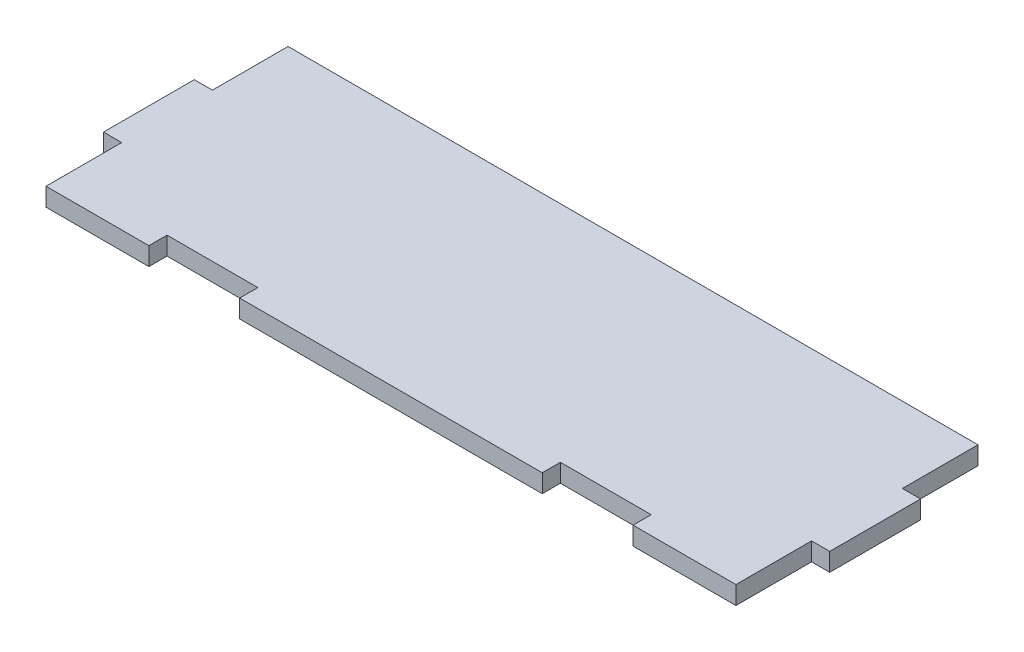
ISO-10303-21;
HEADER;
FILE_DESCRIPTION(('STEP AP214'),'2;1');
FILE_NAME('part.step','',(''),(''),'','','');
FILE_SCHEMA(('AUTOMOTIVE_DESIGN { 1 0 10303 214 1 1 1 1 }'));
ENDSEC;
DATA;
#1=APPLICATION_CONTEXT('core data for automotive mechanical design processes');
#2=APPLICATION_PROTOCOL_DEFINITION('international standard','automotive_design',2000,#1);
#3=PRODUCT_CONTEXT('',#1,'mechanical');
#4=PRODUCT('Part','Part','',(#3));
#5=PRODUCT_RELATED_PRODUCT_CATEGORY('part','',(#4));
#6=PRODUCT_DEFINITION_FORMATION('','',#4);
#7=PRODUCT_DEFINITION_CONTEXT('part definition',#1,'design');
#8=PRODUCT_DEFINITION('design','',#6,#7);
#9=PRODUCT_DEFINITION_SHAPE('','',#8);
#10=(LENGTH_UNIT() NAMED_UNIT(*) SI_UNIT(.MILLI.,.METRE.));
#11=(NAMED_UNIT(*) PLANE_ANGLE_UNIT() SI_UNIT($,.RADIAN.));
#12=(NAMED_UNIT(*) SI_UNIT($,.STERADIAN.) SOLID_ANGLE_UNIT());
#13=UNCERTAINTY_MEASURE_WITH_UNIT(LENGTH_MEASURE(1.E-05),#10,'distance_accuracy_value','');
#14=(GEOMETRIC_REPRESENTATION_CONTEXT(3) GLOBAL_UNCERTAINTY_ASSIGNED_CONTEXT((#13)) GLOBAL_UNIT_ASSIGNED_CONTEXT((#10,
#11,#12)) REPRESENTATION_CONTEXT('',''));
#15=CARTESIAN_POINT('',(0.,0.,0.));
#16=DIRECTION('',(0.,0.,1.));
#17=DIRECTION('',(1.,0.,0.));
#18=AXIS2_PLACEMENT_3D('',#15,#16,#17);
#19=CARTESIAN_POINT('',(-60.0000000000004,3.,20.0000000000001));
#20=DIRECTION('',(0.,0.,-1.00000000000001));
#21=DIRECTION('',(-1.00000000000001,0.,0.));
#22=AXIS2_PLACEMENT_3D('',#19,#20,#21);
#23=PLANE('',#22);
#24=DIRECTION('',(1.00000000000001,0.,0.));
#25=VECTOR('',#24,1.);
#26=CARTESIAN_POINT('',(-60.0000000000004,0.,20.0000000000001));
#27=LINE('',#26,#25);
#28=CARTESIAN_POINT('',(-25.,0.,20.));
#29=VERTEX_POINT('',#28);
#30=CARTESIAN_POINT('',(25.,0.,20.0000000000001));
#31=VERTEX_POINT('',#30);
#32=EDGE_CURVE('E186',#29,#31,#27,.T.);
#33=ORIENTED_EDGE('',*,*,#32,.T.);
#34=DIRECTION('',(0.,1.,0.));
#35=VECTOR('',#34,1.);
#36=CARTESIAN_POINT('',(25.,0.,20.0000000000001));
#37=LINE('',#36,#35);
#38=CARTESIAN_POINT('',(25.,3.,20.0000000000001));
#39=VERTEX_POINT('',#38);
#40=EDGE_CURVE('E170',#31,#39,#37,.T.);
#41=ORIENTED_EDGE('',*,*,#40,.T.);
#42=DIRECTION('',(1.00000000000001,0.,0.));
#43=VECTOR('',#42,1.);
#44=CARTESIAN_POINT('',(-60.0000000000004,3.,20.0000000000001));
#45=LINE('',#44,#43);
#46=CARTESIAN_POINT('',(-25.,3.,20.));
#47=VERTEX_POINT('',#46);
#48=EDGE_CURVE('E218',#47,#39,#45,.T.);
#49=ORIENTED_EDGE('',*,*,#48,.F.);
#50=DIRECTION('',(0.,1.,0.));
#51=VECTOR('',#50,1.);
#52=CARTESIAN_POINT('',(-25.,0.,20.));
#53=LINE('',#52,#51);
#54=EDGE_CURVE('E192',#29,#47,#53,.T.);
#55=ORIENTED_EDGE('',*,*,#54,.F.);
#56=EDGE_LOOP('',(#33,#41,#49,#55));
#57=FACE_BOUND('',#56,.T.);
#58=ADVANCED_FACE('F32',(#57),#23,.F.);
#59=CARTESIAN_POINT('',(-57.0000000000005,0.,20.));
#60=VERTEX_POINT('',#59);
#61=CARTESIAN_POINT('',(-40.,0.,20.));
#62=VERTEX_POINT('',#61);
#63=EDGE_CURVE('E193',#60,#62,#27,.T.);
#64=ORIENTED_EDGE('',*,*,#63,.T.);
#65=DIRECTION('',(0.,1.,0.));
#66=VECTOR('',#65,1.);
#67=CARTESIAN_POINT('',(-40.,0.,20.));
#68=LINE('',#67,#66);
#69=CARTESIAN_POINT('',(-40.,3.,20.));
#70=VERTEX_POINT('',#69);
#71=EDGE_CURVE('E308',#62,#70,#68,.T.);
#72=ORIENTED_EDGE('',*,*,#71,.T.);
#73=CARTESIAN_POINT('',(-57.0000000000005,3.,20.));
#74=VERTEX_POINT('',#73);
#75=EDGE_CURVE('E220',#74,#70,#45,.T.);
#76=ORIENTED_EDGE('',*,*,#75,.F.);
#77=DIRECTION('',(0.,1.,0.));
#78=VECTOR('',#77,1.);
#79=CARTESIAN_POINT('',(-57.0000000000005,0.,20.));
#80=LINE('',#79,#78);
#81=EDGE_CURVE('E263',#60,#74,#80,.T.);
#82=ORIENTED_EDGE('',*,*,#81,.F.);
#83=EDGE_LOOP('',(#64,#72,#76,#82));
#84=FACE_BOUND('',#83,.T.);
#85=ADVANCED_FACE('F306',(#84),#23,.F.);
#86=CARTESIAN_POINT('',(-60.0000000000005,3.,-20.));
#87=DIRECTION('',(1.00000000000001,0.,0.));
#88=DIRECTION('',(0.,0.,-1.00000000000001));
#89=AXIS2_PLACEMENT_3D('',#86,#87,#88);
#90=PLANE('',#89);
#91=DIRECTION('',(0.,0.,1.00000000000001));
#92=VECTOR('',#91,1.);
#93=CARTESIAN_POINT('',(-60.0000000000005,0.,-20.));
#94=LINE('',#93,#92);
#95=CARTESIAN_POINT('',(-60.0000000000003,0.,-7.50000000000006));
#96=VERTEX_POINT('',#95);
#97=CARTESIAN_POINT('',(-60.0000000000004,0.,7.50000000000012));
#98=VERTEX_POINT('',#97);
#99=EDGE_CURVE('E198',#96,#98,#94,.T.);
#100=ORIENTED_EDGE('',*,*,#99,.T.);
#101=DIRECTION('',(0.,1.,0.));
#102=VECTOR('',#101,1.);
#103=CARTESIAN_POINT('',(-60.0000000000004,0.,7.50000000000012));
#104=LINE('',#103,#102);
#105=CARTESIAN_POINT('',(-60.0000000000004,3.,7.50000000000012));
#106=VERTEX_POINT('',#105);
#107=EDGE_CURVE('E266',#98,#106,#104,.T.);
#108=ORIENTED_EDGE('',*,*,#107,.T.);
#109=DIRECTION('',(0.,0.,1.00000000000001));
#110=VECTOR('',#109,1.);
#111=CARTESIAN_POINT('',(-60.0000000000005,3.,-20.));
#112=LINE('',#111,#110);
#113=CARTESIAN_POINT('',(-60.0000000000003,3.,-7.50000000000006));
#114=VERTEX_POINT('',#113);
#115=EDGE_CURVE('E205',#114,#106,#112,.T.);
#116=ORIENTED_EDGE('',*,*,#115,.F.);
#117=DIRECTION('',(0.,1.,0.));
#118=VECTOR('',#117,1.);
#119=CARTESIAN_POINT('',(-60.0000000000003,0.,-7.50000000000006));
#120=LINE('',#119,#118);
#121=EDGE_CURVE('E222',#96,#114,#120,.T.);
#122=ORIENTED_EDGE('',*,*,#121,.F.);
#123=EDGE_LOOP('',(#100,#108,#116,#122));
#124=FACE_BOUND('',#123,.T.);
#125=ADVANCED_FACE('F34',(#124),#90,.F.);
#126=CARTESIAN_POINT('',(40.0000000000001,3.,20.0000000000007));
#127=VERTEX_POINT('',#126);
#128=CARTESIAN_POINT('',(57.0000000000003,3.,20.0000000000001));
#129=VERTEX_POINT('',#128);
#130=EDGE_CURVE('E212',#127,#129,#45,.T.);
#131=ORIENTED_EDGE('',*,*,#130,.F.);
#132=DIRECTION('',(0.,1.,0.));
#133=VECTOR('',#132,1.);
#134=CARTESIAN_POINT('',(40.0000000000001,0.,20.0000000000007));
#135=LINE('',#134,#133);
#136=CARTESIAN_POINT('',(40.0000000000001,0.,20.0000000000007));
#137=VERTEX_POINT('',#136);
#138=EDGE_CURVE('E180',#137,#127,#135,.T.);
#139=ORIENTED_EDGE('',*,*,#138,.F.);
#140=CARTESIAN_POINT('',(57.0000000000003,0.,20.0000000000001));
#141=VERTEX_POINT('',#140);
#142=EDGE_CURVE('E194',#137,#141,#27,.T.);
#143=ORIENTED_EDGE('',*,*,#142,.T.);
#144=DIRECTION('',(0.,1.,0.));
#145=VECTOR('',#144,1.);
#146=CARTESIAN_POINT('',(57.0000000000003,0.,20.0000000000001));
#147=LINE('',#146,#145);
#148=EDGE_CURVE('E345',#141,#129,#147,.T.);
#149=ORIENTED_EDGE('',*,*,#148,.T.);
#150=EDGE_LOOP('',(#131,#139,#143,#149));
#151=FACE_BOUND('',#150,.T.);
#152=ADVANCED_FACE('F367',(#151),#23,.F.);
#153=CARTESIAN_POINT('',(60.0000000000003,3.,-19.9999999999995));
#154=DIRECTION('',(-1.00000000000001,0.,0.));
#155=DIRECTION('',(0.,0.,1.00000000000001));
#156=AXIS2_PLACEMENT_3D('',#153,#154,#155);
#157=PLANE('',#156);
#158=DIRECTION('',(0.,0.,-1.00000000000001));
#159=VECTOR('',#158,1.);
#160=CARTESIAN_POINT('',(60.0000000000003,3.,-19.9999999999995));
#161=LINE('',#160,#159);
#162=CARTESIAN_POINT('',(60.0000000000003,3.,7.50000000000028));
#163=VERTEX_POINT('',#162);
#164=CARTESIAN_POINT('',(60.0000000000003,3.,-7.49999999999951));
#165=VERTEX_POINT('',#164);
#166=EDGE_CURVE('E41',#163,#165,#161,.T.);
#167=ORIENTED_EDGE('',*,*,#166,.F.);
#168=DIRECTION('',(0.,1.,0.));
#169=VECTOR('',#168,1.);
#170=CARTESIAN_POINT('',(60.0000000000003,0.,7.50000000000028));
#171=LINE('',#170,#169);
#172=CARTESIAN_POINT('',(60.0000000000003,0.,7.50000000000028));
#173=VERTEX_POINT('',#172);
#174=EDGE_CURVE('E341',#173,#163,#171,.T.);
#175=ORIENTED_EDGE('',*,*,#174,.F.);
#176=DIRECTION('',(0.,0.,-1.00000000000001));
#177=VECTOR('',#176,1.);
#178=CARTESIAN_POINT('',(60.0000000000003,0.,-19.9999999999995));
#179=LINE('',#178,#177);
#180=CARTESIAN_POINT('',(60.0000000000003,0.,-7.49999999999951));
#181=VERTEX_POINT('',#180);
#182=EDGE_CURVE('E197',#173,#181,#179,.T.);
#183=ORIENTED_EDGE('',*,*,#182,.T.);
#184=DIRECTION('',(0.,1.,0.));
#185=VECTOR('',#184,1.);
#186=CARTESIAN_POINT('',(60.0000000000003,0.,-7.49999999999951));
#187=LINE('',#186,#185);
#188=EDGE_CURVE('E238',#181,#165,#187,.T.);
#189=ORIENTED_EDGE('',*,*,#188,.T.);
#190=EDGE_LOOP('',(#167,#175,#183,#189));
#191=FACE_BOUND('',#190,.T.);
#192=ADVANCED_FACE('F246',(#191),#157,.F.);
#193=CARTESIAN_POINT('',(-60.0000000000005,3.,-20.));
#194=DIRECTION('',(0.,0.,1.00000000000001));
#195=DIRECTION('',(1.00000000000001,0.,0.));
#196=AXIS2_PLACEMENT_3D('',#193,#194,#195);
#197=PLANE('',#196);
#198=DIRECTION('',(-1.00000000000001,0.,0.));
#199=VECTOR('',#198,1.);
#200=CARTESIAN_POINT('',(-60.0000000000005,3.,-20.));
#201=LINE('',#200,#199);
#202=CARTESIAN_POINT('',(57.0000000000001,3.,-19.9999999999996));
#203=VERTEX_POINT('',#202);
#204=CARTESIAN_POINT('',(-57.0000000000006,3.,-19.9999999999999));
#205=VERTEX_POINT('',#204);
#206=EDGE_CURVE('E11',#203,#205,#201,.T.);
#207=ORIENTED_EDGE('',*,*,#206,.F.);
#208=DIRECTION('',(0.,1.,0.));
#209=VECTOR('',#208,1.);
#210=CARTESIAN_POINT('',(57.0000000000001,0.,-19.9999999999996));
#211=LINE('',#210,#209);
#212=CARTESIAN_POINT('',(57.0000000000001,0.,-19.9999999999996));
#213=VERTEX_POINT('',#212);
#214=EDGE_CURVE('E252',#213,#203,#211,.T.);
#215=ORIENTED_EDGE('',*,*,#214,.F.);
#216=DIRECTION('',(-1.00000000000001,0.,0.));
#217=VECTOR('',#216,1.);
#218=CARTESIAN_POINT('',(-60.0000000000005,0.,-20.));
#219=LINE('',#218,#217);
#220=CARTESIAN_POINT('',(-57.0000000000006,0.,-19.9999999999999));
#221=VERTEX_POINT('',#220);
#222=EDGE_CURVE('E36',#213,#221,#219,.T.);
#223=ORIENTED_EDGE('',*,*,#222,.T.);
#224=DIRECTION('',(0.,1.,0.));
#225=VECTOR('',#224,1.);
#226=CARTESIAN_POINT('',(-57.0000000000006,0.,-19.9999999999999));
#227=LINE('',#226,#225);
#228=EDGE_CURVE('E284',#221,#205,#227,.T.);
#229=ORIENTED_EDGE('',*,*,#228,.T.);
#230=EDGE_LOOP('',(#207,#215,#223,#229));
#231=FACE_BOUND('',#230,.T.);
#232=ADVANCED_FACE('F356',(#231),#197,.F.);
#233=CARTESIAN_POINT('',(0.,3.,0.));
#234=DIRECTION('',(0.,1.,0.));
#235=DIRECTION('',(0.,0.,1.00000000000001));
#236=AXIS2_PLACEMENT_3D('',#233,#234,#235);
#237=PLANE('',#236);
#238=DIRECTION('',(0.,0.,1.00000000000001));
#239=VECTOR('',#238,1.);
#240=CARTESIAN_POINT('',(25.,3.,20.0000000000001));
#241=LINE('',#240,#239);
#242=CARTESIAN_POINT('',(25.,3.,17.));
#243=VERTEX_POINT('',#242);
#244=EDGE_CURVE('E175',#243,#39,#241,.T.);
#245=ORIENTED_EDGE('',*,*,#244,.F.);
#246=DIRECTION('',(-1.00000000000001,0.,0.));
#247=VECTOR('',#246,1.);
#248=CARTESIAN_POINT('',(25.,3.,17.));
#249=LINE('',#248,#247);
#250=CARTESIAN_POINT('',(40.0000000000001,3.,17.0000000000006));
#251=VERTEX_POINT('',#250);
#252=EDGE_CURVE('E189',#251,#243,#249,.T.);
#253=ORIENTED_EDGE('',*,*,#252,.F.);
#254=DIRECTION('',(0.,0.,-1.00000000000001));
#255=VECTOR('',#254,1.);
#256=CARTESIAN_POINT('',(40.0000000000001,3.,20.0000000000007));
#257=LINE('',#256,#255);
#258=EDGE_CURVE('E374',#127,#251,#257,.T.);
#259=ORIENTED_EDGE('',*,*,#258,.F.);
#260=ORIENTED_EDGE('',*,*,#130,.T.);
#261=DIRECTION('',(0.,0.,1.00000000000001));
#262=VECTOR('',#261,1.);
#263=CARTESIAN_POINT('',(57.0000000000003,3.,20.0000000000001));
#264=LINE('',#263,#262);
#265=CARTESIAN_POINT('',(57.0000000000003,3.,7.50000000000012));
#266=VERTEX_POINT('',#265);
#267=EDGE_CURVE('E338',#266,#129,#264,.T.);
#268=ORIENTED_EDGE('',*,*,#267,.F.);
#269=DIRECTION('',(-1.00000000000001,0.,0.));
#270=VECTOR('',#269,1.);
#271=CARTESIAN_POINT('',(60.0000000000003,3.,7.50000000000028));
#272=LINE('',#271,#270);
#273=EDGE_CURVE('E235',#163,#266,#272,.T.);
#274=ORIENTED_EDGE('',*,*,#273,.F.);
#275=ORIENTED_EDGE('',*,*,#166,.T.);
#276=DIRECTION('',(1.00000000000001,0.,0.));
#277=VECTOR('',#276,1.);
#278=CARTESIAN_POINT('',(60.0000000000003,3.,-7.49999999999951));
#279=LINE('',#278,#277);
#280=CARTESIAN_POINT('',(57.0000000000003,3.,-7.49999999999962));
#281=VERTEX_POINT('',#280);
#282=EDGE_CURVE('E232',#281,#165,#279,.T.);
#283=ORIENTED_EDGE('',*,*,#282,.F.);
#284=DIRECTION('',(0.,0.,1.00000000000001));
#285=VECTOR('',#284,1.);
#286=CARTESIAN_POINT('',(57.0000000000001,3.,-19.9999999999996));
#287=LINE('',#286,#285);
#288=EDGE_CURVE('E244',#203,#281,#287,.T.);
#289=ORIENTED_EDGE('',*,*,#288,.F.);
#290=ORIENTED_EDGE('',*,*,#206,.T.);
#291=DIRECTION('',(0.,0.,-1.00000000000001));
#292=VECTOR('',#291,1.);
#293=CARTESIAN_POINT('',(-57.0000000000006,3.,-19.9999999999999));
#294=LINE('',#293,#292);
#295=CARTESIAN_POINT('',(-57.0000000000004,3.,-7.49999999999995));
#296=VERTEX_POINT('',#295);
#297=EDGE_CURVE('E277',#296,#205,#294,.T.);
#298=ORIENTED_EDGE('',*,*,#297,.F.);
#299=DIRECTION('',(1.00000000000001,0.,0.));
#300=VECTOR('',#299,1.);
#301=CARTESIAN_POINT('',(-60.0000000000003,3.,-7.50000000000006));
#302=LINE('',#301,#300);
#303=EDGE_CURVE('E269',#114,#296,#302,.T.);
#304=ORIENTED_EDGE('',*,*,#303,.F.);
#305=ORIENTED_EDGE('',*,*,#115,.T.);
#306=DIRECTION('',(-1.00000000000001,0.,0.));
#307=VECTOR('',#306,1.);
#308=CARTESIAN_POINT('',(-60.0000000000004,3.,7.50000000000012));
#309=LINE('',#308,#307);
#310=CARTESIAN_POINT('',(-57.0000000000005,3.,7.49999999999984));
#311=VERTEX_POINT('',#310);
#312=EDGE_CURVE('E250',#311,#106,#309,.T.);
#313=ORIENTED_EDGE('',*,*,#312,.F.);
#314=DIRECTION('',(0.,0.,-1.00000000000001));
#315=VECTOR('',#314,1.);
#316=CARTESIAN_POINT('',(-57.0000000000005,3.,20.));
#317=LINE('',#316,#315);
#318=EDGE_CURVE('E247',#74,#311,#317,.T.);
#319=ORIENTED_EDGE('',*,*,#318,.F.);
#320=ORIENTED_EDGE('',*,*,#75,.T.);
#321=DIRECTION('',(0.,0.,1.00000000000001));
#322=VECTOR('',#321,1.);
#323=CARTESIAN_POINT('',(-40.,3.,20.));
#324=LINE('',#323,#322);
#325=CARTESIAN_POINT('',(-40.0000000000001,3.,17.0000000000001));
#326=VERTEX_POINT('',#325);
#327=EDGE_CURVE('E311',#326,#70,#324,.T.);
#328=ORIENTED_EDGE('',*,*,#327,.F.);
#329=DIRECTION('',(-1.00000000000001,0.,0.));
#330=VECTOR('',#329,1.);
#331=CARTESIAN_POINT('',(-40.0000000000001,3.,17.0000000000001));
#332=LINE('',#331,#330);
#333=CARTESIAN_POINT('',(-25.,3.,17.0000000000001));
#334=VERTEX_POINT('',#333);
#335=EDGE_CURVE('E314',#334,#326,#332,.T.);
#336=ORIENTED_EDGE('',*,*,#335,.F.);
#337=DIRECTION('',(0.,0.,-1.00000000000001));
#338=VECTOR('',#337,1.);
#339=CARTESIAN_POINT('',(-25.,3.,20.));
#340=LINE('',#339,#338);
#341=EDGE_CURVE('E316',#47,#334,#340,.T.);
#342=ORIENTED_EDGE('',*,*,#341,.F.);
#343=ORIENTED_EDGE('',*,*,#48,.T.);
#344=EDGE_LOOP('',(#245,#253,#259,#260,#268,#274,#275,#283,#289,#290,#298,#304,#305,#313,#319,
#320,#328,#336,#342,#343));
#345=FACE_BOUND('',#344,.T.);
#346=ADVANCED_FACE('F230',(#345),#237,.T.);
#347=CARTESIAN_POINT('',(0.,0.,0.));
#348=DIRECTION('',(0.,1.,0.));
#349=DIRECTION('',(0.,0.,1.00000000000001));
#350=AXIS2_PLACEMENT_3D('',#347,#348,#349);
#351=PLANE('',#350);
#352=DIRECTION('',(-1.00000000000001,0.,0.));
#353=VECTOR('',#352,1.);
#354=CARTESIAN_POINT('',(25.,0.,17.));
#355=LINE('',#354,#353);
#356=CARTESIAN_POINT('',(40.0000000000001,0.,17.0000000000006));
#357=VERTEX_POINT('',#356);
#358=CARTESIAN_POINT('',(25.,0.,17.));
#359=VERTEX_POINT('',#358);
#360=EDGE_CURVE('E49',#357,#359,#355,.T.);
#361=ORIENTED_EDGE('',*,*,#360,.T.);
#362=DIRECTION('',(0.,0.,1.00000000000001));
#363=VECTOR('',#362,1.);
#364=CARTESIAN_POINT('',(25.,0.,20.0000000000001));
#365=LINE('',#364,#363);
#366=EDGE_CURVE('E173',#359,#31,#365,.T.);
#367=ORIENTED_EDGE('',*,*,#366,.T.);
#368=ORIENTED_EDGE('',*,*,#32,.F.);
#369=DIRECTION('',(0.,0.,-1.00000000000001));
#370=VECTOR('',#369,1.);
#371=CARTESIAN_POINT('',(-25.,0.,20.));
#372=LINE('',#371,#370);
#373=CARTESIAN_POINT('',(-25.,0.,17.0000000000001));
#374=VERTEX_POINT('',#373);
#375=EDGE_CURVE('E381',#29,#374,#372,.T.);
#376=ORIENTED_EDGE('',*,*,#375,.T.);
#377=DIRECTION('',(-1.00000000000001,0.,0.));
#378=VECTOR('',#377,1.);
#379=CARTESIAN_POINT('',(-40.0000000000001,0.,17.0000000000001));
#380=LINE('',#379,#378);
#381=CARTESIAN_POINT('',(-40.0000000000001,0.,17.0000000000001));
#382=VERTEX_POINT('',#381);
#383=EDGE_CURVE('E57',#374,#382,#380,.T.);
#384=ORIENTED_EDGE('',*,*,#383,.T.);
#385=DIRECTION('',(0.,0.,1.00000000000001));
#386=VECTOR('',#385,1.);
#387=CARTESIAN_POINT('',(-40.,0.,20.));
#388=LINE('',#387,#386);
#389=EDGE_CURVE('E327',#382,#62,#388,.T.);
#390=ORIENTED_EDGE('',*,*,#389,.T.);
#391=ORIENTED_EDGE('',*,*,#63,.F.);
#392=DIRECTION('',(0.,0.,-1.00000000000001));
#393=VECTOR('',#392,1.);
#394=CARTESIAN_POINT('',(-57.0000000000005,0.,20.));
#395=LINE('',#394,#393);
#396=CARTESIAN_POINT('',(-57.0000000000005,0.,7.49999999999984));
#397=VERTEX_POINT('',#396);
#398=EDGE_CURVE('E258',#60,#397,#395,.T.);
#399=ORIENTED_EDGE('',*,*,#398,.T.);
#400=DIRECTION('',(-1.00000000000001,0.,0.));
#401=VECTOR('',#400,1.);
#402=CARTESIAN_POINT('',(-60.0000000000004,0.,7.50000000000012));
#403=LINE('',#402,#401);
#404=EDGE_CURVE('E261',#397,#98,#403,.T.);
#405=ORIENTED_EDGE('',*,*,#404,.T.);
#406=ORIENTED_EDGE('',*,*,#99,.F.);
#407=DIRECTION('',(1.00000000000001,0.,0.));
#408=VECTOR('',#407,1.);
#409=CARTESIAN_POINT('',(-60.0000000000003,0.,-7.50000000000006));
#410=LINE('',#409,#408);
#411=CARTESIAN_POINT('',(-57.0000000000004,0.,-7.49999999999995));
#412=VERTEX_POINT('',#411);
#413=EDGE_CURVE('E273',#96,#412,#410,.T.);
#414=ORIENTED_EDGE('',*,*,#413,.T.);
#415=DIRECTION('',(0.,0.,-1.00000000000001));
#416=VECTOR('',#415,1.);
#417=CARTESIAN_POINT('',(-57.0000000000006,0.,-19.9999999999999));
#418=LINE('',#417,#416);
#419=EDGE_CURVE('E276',#412,#221,#418,.T.);
#420=ORIENTED_EDGE('',*,*,#419,.T.);
#421=ORIENTED_EDGE('',*,*,#222,.F.);
#422=DIRECTION('',(0.,0.,1.00000000000001));
#423=VECTOR('',#422,1.);
#424=CARTESIAN_POINT('',(57.0000000000001,0.,-19.9999999999996));
#425=LINE('',#424,#423);
#426=CARTESIAN_POINT('',(57.0000000000003,0.,-7.49999999999962));
#427=VERTEX_POINT('',#426);
#428=EDGE_CURVE('E243',#213,#427,#425,.T.);
#429=ORIENTED_EDGE('',*,*,#428,.T.);
#430=DIRECTION('',(1.00000000000001,0.,0.));
#431=VECTOR('',#430,1.);
#432=CARTESIAN_POINT('',(60.0000000000003,0.,-7.49999999999951));
#433=LINE('',#432,#431);
#434=EDGE_CURVE('E257',#427,#181,#433,.T.);
#435=ORIENTED_EDGE('',*,*,#434,.T.);
#436=ORIENTED_EDGE('',*,*,#182,.F.);
#437=DIRECTION('',(-1.00000000000001,0.,0.));
#438=VECTOR('',#437,1.);
#439=CARTESIAN_POINT('',(60.0000000000003,0.,7.50000000000028));
#440=LINE('',#439,#438);
#441=CARTESIAN_POINT('',(57.0000000000003,0.,7.50000000000012));
#442=VERTEX_POINT('',#441);
#443=EDGE_CURVE('E334',#173,#442,#440,.T.);
#444=ORIENTED_EDGE('',*,*,#443,.T.);
#445=DIRECTION('',(0.,0.,1.00000000000001));
#446=VECTOR('',#445,1.);
#447=CARTESIAN_POINT('',(57.0000000000003,0.,20.0000000000001));
#448=LINE('',#447,#446);
#449=EDGE_CURVE('E337',#442,#141,#448,.T.);
#450=ORIENTED_EDGE('',*,*,#449,.T.);
#451=ORIENTED_EDGE('',*,*,#142,.F.);
#452=DIRECTION('',(0.,0.,-1.00000000000001));
#453=VECTOR('',#452,1.);
#454=CARTESIAN_POINT('',(40.0000000000001,0.,20.0000000000007));
#455=LINE('',#454,#453);
#456=EDGE_CURVE('E188',#137,#357,#455,.T.);
#457=ORIENTED_EDGE('',*,*,#456,.T.);
#458=EDGE_LOOP('',(#361,#367,#368,#376,#384,#390,#391,#399,#405,#406,#414,#420,#421,#429,#435,
#436,#444,#450,#451,#457));
#459=FACE_BOUND('',#458,.T.);
#460=ADVANCED_FACE('F184',(#459),#351,.F.);
#461=CARTESIAN_POINT('',(-57.0000000000006,0.,-19.9999999999999));
#462=DIRECTION('',(1.00000000000001,0.,0.));
#463=DIRECTION('',(0.,0.,-1.00000000000001));
#464=AXIS2_PLACEMENT_3D('',#461,#462,#463);
#465=PLANE('',#464);
#466=ORIENTED_EDGE('',*,*,#297,.T.);
#467=ORIENTED_EDGE('',*,*,#228,.F.);
#468=ORIENTED_EDGE('',*,*,#419,.F.);
#469=DIRECTION('',(0.,1.,0.));
#470=VECTOR('',#469,1.);
#471=CARTESIAN_POINT('',(-57.0000000000004,0.,-7.49999999999995));
#472=LINE('',#471,#470);
#473=EDGE_CURVE('E285',#412,#296,#472,.T.);
#474=ORIENTED_EDGE('',*,*,#473,.T.);
#475=EDGE_LOOP('',(#466,#467,#468,#474));
#476=FACE_BOUND('',#475,.T.);
#477=ADVANCED_FACE('F357',(#476),#465,.F.);
#478=CARTESIAN_POINT('',(-60.0000000000003,0.,-7.50000000000006));
#479=DIRECTION('',(0.,0.,1.00000000000001));
#480=DIRECTION('',(1.00000000000001,0.,0.));
#481=AXIS2_PLACEMENT_3D('',#478,#479,#480);
#482=PLANE('',#481);
#483=ORIENTED_EDGE('',*,*,#303,.T.);
#484=ORIENTED_EDGE('',*,*,#473,.F.);
#485=ORIENTED_EDGE('',*,*,#413,.F.);
#486=ORIENTED_EDGE('',*,*,#121,.T.);
#487=EDGE_LOOP('',(#483,#484,#485,#486));
#488=FACE_BOUND('',#487,.T.);
#489=ADVANCED_FACE('F290',(#488),#482,.F.);
#490=CARTESIAN_POINT('',(-60.0000000000004,0.,7.50000000000012));
#491=DIRECTION('',(0.,0.,-1.00000000000001));
#492=DIRECTION('',(-1.00000000000001,0.,0.));
#493=AXIS2_PLACEMENT_3D('',#490,#491,#492);
#494=PLANE('',#493);
#495=ORIENTED_EDGE('',*,*,#312,.T.);
#496=ORIENTED_EDGE('',*,*,#107,.F.);
#497=ORIENTED_EDGE('',*,*,#404,.F.);
#498=DIRECTION('',(0.,1.,0.));
#499=VECTOR('',#498,1.);
#500=CARTESIAN_POINT('',(-57.0000000000005,0.,7.49999999999984));
#501=LINE('',#500,#499);
#502=EDGE_CURVE('E270',#397,#311,#501,.T.);
#503=ORIENTED_EDGE('',*,*,#502,.T.);
#504=EDGE_LOOP('',(#495,#496,#497,#503));
#505=FACE_BOUND('',#504,.T.);
#506=ADVANCED_FACE('F296',(#505),#494,.F.);
#507=CARTESIAN_POINT('',(-57.0000000000005,0.,20.));
#508=DIRECTION('',(1.00000000000001,0.,0.));
#509=DIRECTION('',(0.,0.,-1.00000000000001));
#510=AXIS2_PLACEMENT_3D('',#507,#508,#509);
#511=PLANE('',#510);
#512=ORIENTED_EDGE('',*,*,#318,.T.);
#513=ORIENTED_EDGE('',*,*,#502,.F.);
#514=ORIENTED_EDGE('',*,*,#398,.F.);
#515=ORIENTED_EDGE('',*,*,#81,.T.);
#516=EDGE_LOOP('',(#512,#513,#514,#515));
#517=FACE_BOUND('',#516,.T.);
#518=ADVANCED_FACE('F302',(#517),#511,.F.);
#519=CARTESIAN_POINT('',(60.0000000000003,0.,-7.49999999999951));
#520=DIRECTION('',(0.,0.,1.00000000000001));
#521=DIRECTION('',(1.00000000000001,0.,0.));
#522=AXIS2_PLACEMENT_3D('',#519,#520,#521);
#523=PLANE('',#522);
#524=ORIENTED_EDGE('',*,*,#282,.T.);
#525=ORIENTED_EDGE('',*,*,#188,.F.);
#526=ORIENTED_EDGE('',*,*,#434,.F.);
#527=DIRECTION('',(0.,1.,0.));
#528=VECTOR('',#527,1.);
#529=CARTESIAN_POINT('',(57.0000000000003,0.,-7.49999999999962));
#530=LINE('',#529,#528);
#531=EDGE_CURVE('E241',#427,#281,#530,.T.);
#532=ORIENTED_EDGE('',*,*,#531,.T.);
#533=EDGE_LOOP('',(#524,#525,#526,#532));
#534=FACE_BOUND('',#533,.T.);
#535=ADVANCED_FACE('F237',(#534),#523,.F.);
#536=CARTESIAN_POINT('',(57.0000000000001,0.,-19.9999999999996));
#537=DIRECTION('',(-1.00000000000001,0.,0.));
#538=DIRECTION('',(0.,0.,1.00000000000001));
#539=AXIS2_PLACEMENT_3D('',#536,#537,#538);
#540=PLANE('',#539);
#541=ORIENTED_EDGE('',*,*,#288,.T.);
#542=ORIENTED_EDGE('',*,*,#531,.F.);
#543=ORIENTED_EDGE('',*,*,#428,.F.);
#544=ORIENTED_EDGE('',*,*,#214,.T.);
#545=EDGE_LOOP('',(#541,#542,#543,#544));
#546=FACE_BOUND('',#545,.T.);
#547=ADVANCED_FACE('F354',(#546),#540,.F.);
#548=CARTESIAN_POINT('',(57.0000000000003,0.,20.0000000000001));
#549=DIRECTION('',(-1.00000000000001,0.,0.));
#550=DIRECTION('',(0.,0.,1.00000000000001));
#551=AXIS2_PLACEMENT_3D('',#548,#549,#550);
#552=PLANE('',#551);
#553=ORIENTED_EDGE('',*,*,#267,.T.);
#554=ORIENTED_EDGE('',*,*,#148,.F.);
#555=ORIENTED_EDGE('',*,*,#449,.F.);
#556=DIRECTION('',(0.,1.,0.));
#557=VECTOR('',#556,1.);
#558=CARTESIAN_POINT('',(57.0000000000003,0.,7.50000000000012));
#559=LINE('',#558,#557);
#560=EDGE_CURVE('E348',#442,#266,#559,.T.);
#561=ORIENTED_EDGE('',*,*,#560,.T.);
#562=EDGE_LOOP('',(#553,#554,#555,#561));
#563=FACE_BOUND('',#562,.T.);
#564=ADVANCED_FACE('F363',(#563),#552,.F.);
#565=CARTESIAN_POINT('',(60.0000000000003,0.,7.50000000000028));
#566=DIRECTION('',(0.,0.,-1.00000000000001));
#567=DIRECTION('',(-1.00000000000001,0.,0.));
#568=AXIS2_PLACEMENT_3D('',#565,#566,#567);
#569=PLANE('',#568);
#570=ORIENTED_EDGE('',*,*,#273,.T.);
#571=ORIENTED_EDGE('',*,*,#560,.F.);
#572=ORIENTED_EDGE('',*,*,#443,.F.);
#573=ORIENTED_EDGE('',*,*,#174,.T.);
#574=EDGE_LOOP('',(#570,#571,#572,#573));
#575=FACE_BOUND('',#574,.T.);
#576=ADVANCED_FACE('F361',(#575),#569,.F.);
#577=CARTESIAN_POINT('',(-40.,0.,20.));
#578=DIRECTION('',(-1.00000000000001,0.,0.));
#579=DIRECTION('',(0.,0.,1.00000000000001));
#580=AXIS2_PLACEMENT_3D('',#577,#578,#579);
#581=PLANE('',#580);
#582=ORIENTED_EDGE('',*,*,#327,.T.);
#583=ORIENTED_EDGE('',*,*,#71,.F.);
#584=ORIENTED_EDGE('',*,*,#389,.F.);
#585=DIRECTION('',(0.,1.,0.));
#586=VECTOR('',#585,1.);
#587=CARTESIAN_POINT('',(-40.0000000000001,0.,17.0000000000001));
#588=LINE('',#587,#586);
#589=EDGE_CURVE('E328',#382,#326,#588,.T.);
#590=ORIENTED_EDGE('',*,*,#589,.T.);
#591=EDGE_LOOP('',(#582,#583,#584,#590));
#592=FACE_BOUND('',#591,.T.);
#593=ADVANCED_FACE('F383',(#592),#581,.F.);
#594=CARTESIAN_POINT('',(-40.0000000000001,0.,17.0000000000001));
#595=DIRECTION('',(0.,0.,-1.00000000000001));
#596=DIRECTION('',(-1.00000000000001,0.,0.));
#597=AXIS2_PLACEMENT_3D('',#594,#595,#596);
#598=PLANE('',#597);
#599=ORIENTED_EDGE('',*,*,#335,.T.);
#600=ORIENTED_EDGE('',*,*,#589,.F.);
#601=ORIENTED_EDGE('',*,*,#383,.F.);
#602=DIRECTION('',(0.,1.,0.));
#603=VECTOR('',#602,1.);
#604=CARTESIAN_POINT('',(-25.,0.,17.0000000000001));
#605=LINE('',#604,#603);
#606=EDGE_CURVE('E330',#374,#334,#605,.T.);
#607=ORIENTED_EDGE('',*,*,#606,.T.);
#608=EDGE_LOOP('',(#599,#600,#601,#607));
#609=FACE_BOUND('',#608,.T.);
#610=ADVANCED_FACE('F384',(#609),#598,.F.);
#611=CARTESIAN_POINT('',(-25.,0.,20.));
#612=DIRECTION('',(1.00000000000001,0.,0.));
#613=DIRECTION('',(0.,0.,-1.00000000000001));
#614=AXIS2_PLACEMENT_3D('',#611,#612,#613);
#615=PLANE('',#614);
#616=ORIENTED_EDGE('',*,*,#341,.T.);
#617=ORIENTED_EDGE('',*,*,#606,.F.);
#618=ORIENTED_EDGE('',*,*,#375,.F.);
#619=ORIENTED_EDGE('',*,*,#54,.T.);
#620=EDGE_LOOP('',(#616,#617,#618,#619));
#621=FACE_BOUND('',#620,.T.);
#622=ADVANCED_FACE('F386',(#621),#615,.F.);
#623=CARTESIAN_POINT('',(25.,0.,20.0000000000001));
#624=DIRECTION('',(-1.00000000000001,0.,0.));
#625=DIRECTION('',(0.,0.,1.00000000000001));
#626=AXIS2_PLACEMENT_3D('',#623,#624,#625);
#627=PLANE('',#626);
#628=ORIENTED_EDGE('',*,*,#244,.T.);
#629=ORIENTED_EDGE('',*,*,#40,.F.);
#630=ORIENTED_EDGE('',*,*,#366,.F.);
#631=DIRECTION('',(0.,1.,0.));
#632=VECTOR('',#631,1.);
#633=CARTESIAN_POINT('',(25.,0.,17.));
#634=LINE('',#633,#632);
#635=EDGE_CURVE('E317',#359,#243,#634,.T.);
#636=ORIENTED_EDGE('',*,*,#635,.T.);
#637=EDGE_LOOP('',(#628,#629,#630,#636));
#638=FACE_BOUND('',#637,.T.);
#639=ADVANCED_FACE('F172',(#638),#627,.F.);
#640=CARTESIAN_POINT('',(25.,0.,17.));
#641=DIRECTION('',(0.,0.,-1.00000000000001));
#642=DIRECTION('',(-1.00000000000001,0.,0.));
#643=AXIS2_PLACEMENT_3D('',#640,#641,#642);
#644=PLANE('',#643);
#645=ORIENTED_EDGE('',*,*,#252,.T.);
#646=ORIENTED_EDGE('',*,*,#635,.F.);
#647=ORIENTED_EDGE('',*,*,#360,.F.);
#648=DIRECTION('',(0.,1.,0.));
#649=VECTOR('',#648,1.);
#650=CARTESIAN_POINT('',(40.0000000000001,0.,17.0000000000006));
#651=LINE('',#650,#649);
#652=EDGE_CURVE('E321',#357,#251,#651,.T.);
#653=ORIENTED_EDGE('',*,*,#652,.T.);
#654=EDGE_LOOP('',(#645,#646,#647,#653));
#655=FACE_BOUND('',#654,.T.);
#656=ADVANCED_FACE('F389',(#655),#644,.F.);
#657=CARTESIAN_POINT('',(40.0000000000001,0.,20.0000000000007));
#658=DIRECTION('',(1.00000000000001,0.,0.));
#659=DIRECTION('',(0.,0.,-1.00000000000001));
#660=AXIS2_PLACEMENT_3D('',#657,#658,#659);
#661=PLANE('',#660);
#662=ORIENTED_EDGE('',*,*,#258,.T.);
#663=ORIENTED_EDGE('',*,*,#652,.F.);
#664=ORIENTED_EDGE('',*,*,#456,.F.);
#665=ORIENTED_EDGE('',*,*,#138,.T.);
#666=EDGE_LOOP('',(#662,#663,#664,#665));
#667=FACE_BOUND('',#666,.T.);
#668=ADVANCED_FACE('F390',(#667),#661,.F.);
#669=CLOSED_SHELL('',(#58,#85,#125,#152,#192,#232,#346,#460,#477,#489,#506,#518,#535,#547,#564,
#576,#593,#610,#622,#639,#656,#668));
#670=MANIFOLD_SOLID_BREP('B2',#669);
#671=ADVANCED_BREP_SHAPE_REPRESENTATION('',(#18,#670),#14);
#672=SHAPE_DEFINITION_REPRESENTATION(#9,#671);
ENDSEC;
END-ISO-10303-21;
